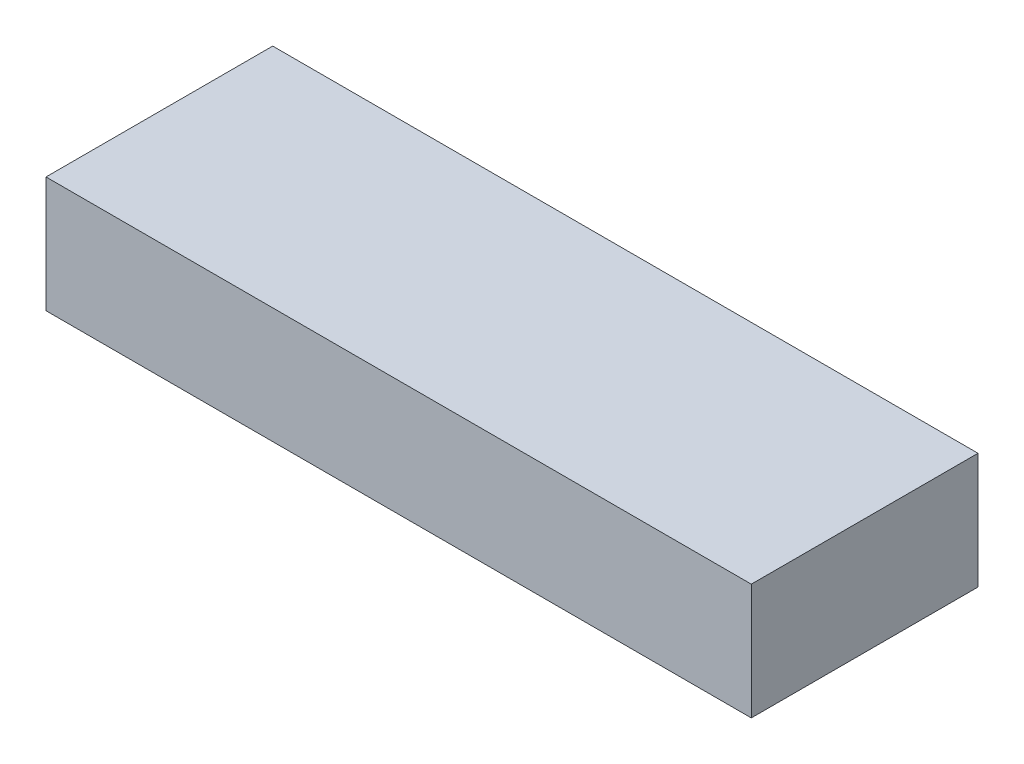
ISO-10303-21;
HEADER;
FILE_DESCRIPTION(('STEP AP214'),'2;1');
FILE_NAME('part.step','',(''),(''),'','','');
FILE_SCHEMA(('AUTOMOTIVE_DESIGN { 1 0 10303 214 1 1 1 1 }'));
ENDSEC;
DATA;
#1=APPLICATION_CONTEXT('core data for automotive mechanical design processes');
#2=APPLICATION_PROTOCOL_DEFINITION('international standard','automotive_design',2000,#1);
#3=PRODUCT_CONTEXT('',#1,'mechanical');
#4=PRODUCT('Part','Part','',(#3));
#5=PRODUCT_RELATED_PRODUCT_CATEGORY('part','',(#4));
#6=PRODUCT_DEFINITION_FORMATION('','',#4);
#7=PRODUCT_DEFINITION_CONTEXT('part definition',#1,'design');
#8=PRODUCT_DEFINITION('design','',#6,#7);
#9=PRODUCT_DEFINITION_SHAPE('','',#8);
#10=(LENGTH_UNIT() NAMED_UNIT(*) SI_UNIT(.MILLI.,.METRE.));
#11=(NAMED_UNIT(*) PLANE_ANGLE_UNIT() SI_UNIT($,.RADIAN.));
#12=(NAMED_UNIT(*) SI_UNIT($,.STERADIAN.) SOLID_ANGLE_UNIT());
#13=UNCERTAINTY_MEASURE_WITH_UNIT(LENGTH_MEASURE(1.E-05),#10,'distance_accuracy_value','');
#14=(GEOMETRIC_REPRESENTATION_CONTEXT(3) GLOBAL_UNCERTAINTY_ASSIGNED_CONTEXT((#13)) GLOBAL_UNIT_ASSIGNED_CONTEXT((#10,
#11,#12)) REPRESENTATION_CONTEXT('',''));
#15=CARTESIAN_POINT('',(0.,0.,0.));
#16=DIRECTION('',(0.,0.,1.));
#17=DIRECTION('',(1.,0.,0.));
#18=AXIS2_PLACEMENT_3D('',#15,#16,#17);
#19=CARTESIAN_POINT('',(70.,23.,22.5));
#20=DIRECTION('',(-1.,0.,0.));
#21=DIRECTION('',(0.,0.,1.));
#22=AXIS2_PLACEMENT_3D('',#19,#20,#21);
#23=PLANE('',#22);
#24=DIRECTION('',(0.,0.,-1.));
#25=VECTOR('',#24,1.);
#26=CARTESIAN_POINT('',(70.,0.,22.5));
#27=LINE('',#26,#25);
#28=CARTESIAN_POINT('',(70.,0.,22.5));
#29=VERTEX_POINT('',#28);
#30=CARTESIAN_POINT('',(70.,0.,-22.5));
#31=VERTEX_POINT('',#30);
#32=EDGE_CURVE('E100',#29,#31,#27,.T.);
#33=ORIENTED_EDGE('',*,*,#32,.T.);
#34=DIRECTION('',(0.,-1.,0.));
#35=VECTOR('',#34,1.);
#36=CARTESIAN_POINT('',(70.,23.,-22.5));
#37=LINE('',#36,#35);
#38=CARTESIAN_POINT('',(70.,23.,-22.5));
#39=VERTEX_POINT('',#38);
#40=EDGE_CURVE('E11',#39,#31,#37,.T.);
#41=ORIENTED_EDGE('',*,*,#40,.F.);
#42=DIRECTION('',(0.,0.,-1.));
#43=VECTOR('',#42,1.);
#44=CARTESIAN_POINT('',(70.,23.,22.5));
#45=LINE('',#44,#43);
#46=CARTESIAN_POINT('',(70.,23.,22.5));
#47=VERTEX_POINT('',#46);
#48=EDGE_CURVE('E88',#47,#39,#45,.T.);
#49=ORIENTED_EDGE('',*,*,#48,.F.);
#50=DIRECTION('',(0.,-1.,0.));
#51=VECTOR('',#50,1.);
#52=CARTESIAN_POINT('',(70.,23.,22.5));
#53=LINE('',#52,#51);
#54=EDGE_CURVE('E96',#47,#29,#53,.T.);
#55=ORIENTED_EDGE('',*,*,#54,.T.);
#56=EDGE_LOOP('',(#33,#41,#49,#55));
#57=FACE_BOUND('',#56,.T.);
#58=ADVANCED_FACE('F37',(#57),#23,.F.);
#59=CARTESIAN_POINT('',(-70.,23.,-22.5));
#60=DIRECTION('',(0.,0.,1.));
#61=DIRECTION('',(1.,0.,0.));
#62=AXIS2_PLACEMENT_3D('',#59,#60,#61);
#63=PLANE('',#62);
#64=DIRECTION('',(-1.,0.,0.));
#65=VECTOR('',#64,1.);
#66=CARTESIAN_POINT('',(-70.,0.,-22.5));
#67=LINE('',#66,#65);
#68=CARTESIAN_POINT('',(-70.,0.,-22.5));
#69=VERTEX_POINT('',#68);
#70=EDGE_CURVE('E92',#31,#69,#67,.T.);
#71=ORIENTED_EDGE('',*,*,#70,.T.);
#72=DIRECTION('',(0.,-1.,0.));
#73=VECTOR('',#72,1.);
#74=CARTESIAN_POINT('',(-70.,23.,-22.5));
#75=LINE('',#74,#73);
#76=CARTESIAN_POINT('',(-70.,23.,-22.5));
#77=VERTEX_POINT('',#76);
#78=EDGE_CURVE('E45',#77,#69,#75,.T.);
#79=ORIENTED_EDGE('',*,*,#78,.F.);
#80=DIRECTION('',(-1.,0.,0.));
#81=VECTOR('',#80,1.);
#82=CARTESIAN_POINT('',(-70.,23.,-22.5));
#83=LINE('',#82,#81);
#84=EDGE_CURVE('E83',#39,#77,#83,.T.);
#85=ORIENTED_EDGE('',*,*,#84,.F.);
#86=ORIENTED_EDGE('',*,*,#40,.T.);
#87=EDGE_LOOP('',(#71,#79,#85,#86));
#88=FACE_BOUND('',#87,.T.);
#89=ADVANCED_FACE('F91',(#88),#63,.F.);
#90=CARTESIAN_POINT('',(-70.,23.,22.5));
#91=DIRECTION('',(1.,0.,0.));
#92=DIRECTION('',(0.,0.,-1.));
#93=AXIS2_PLACEMENT_3D('',#90,#91,#92);
#94=PLANE('',#93);
#95=DIRECTION('',(0.,0.,1.));
#96=VECTOR('',#95,1.);
#97=CARTESIAN_POINT('',(-70.,0.,22.5));
#98=LINE('',#97,#96);
#99=CARTESIAN_POINT('',(-70.,0.,22.5));
#100=VERTEX_POINT('',#99);
#101=EDGE_CURVE('E70',#69,#100,#98,.T.);
#102=ORIENTED_EDGE('',*,*,#101,.T.);
#103=DIRECTION('',(0.,-1.,0.));
#104=VECTOR('',#103,1.);
#105=CARTESIAN_POINT('',(-70.,23.,22.5));
#106=LINE('',#105,#104);
#107=CARTESIAN_POINT('',(-70.,23.,22.5));
#108=VERTEX_POINT('',#107);
#109=EDGE_CURVE('E93',#108,#100,#106,.T.);
#110=ORIENTED_EDGE('',*,*,#109,.F.);
#111=DIRECTION('',(0.,0.,1.));
#112=VECTOR('',#111,1.);
#113=CARTESIAN_POINT('',(-70.,23.,22.5));
#114=LINE('',#113,#112);
#115=EDGE_CURVE('E86',#77,#108,#114,.T.);
#116=ORIENTED_EDGE('',*,*,#115,.F.);
#117=ORIENTED_EDGE('',*,*,#78,.T.);
#118=EDGE_LOOP('',(#102,#110,#116,#117));
#119=FACE_BOUND('',#118,.T.);
#120=ADVANCED_FACE('F94',(#119),#94,.F.);
#121=CARTESIAN_POINT('',(-70.,23.,22.5));
#122=DIRECTION('',(0.,0.,-1.));
#123=DIRECTION('',(-1.,0.,0.));
#124=AXIS2_PLACEMENT_3D('',#121,#122,#123);
#125=PLANE('',#124);
#126=DIRECTION('',(1.,0.,0.));
#127=VECTOR('',#126,1.);
#128=CARTESIAN_POINT('',(-70.,0.,22.5));
#129=LINE('',#128,#127);
#130=EDGE_CURVE('E76',#100,#29,#129,.T.);
#131=ORIENTED_EDGE('',*,*,#130,.T.);
#132=ORIENTED_EDGE('',*,*,#54,.F.);
#133=DIRECTION('',(1.,0.,0.));
#134=VECTOR('',#133,1.);
#135=CARTESIAN_POINT('',(-70.,23.,22.5));
#136=LINE('',#135,#134);
#137=EDGE_CURVE('E53',#108,#47,#136,.T.);
#138=ORIENTED_EDGE('',*,*,#137,.F.);
#139=ORIENTED_EDGE('',*,*,#109,.T.);
#140=EDGE_LOOP('',(#131,#132,#138,#139));
#141=FACE_BOUND('',#140,.T.);
#142=ADVANCED_FACE('F107',(#141),#125,.F.);
#143=CARTESIAN_POINT('',(0.,23.,0.));
#144=DIRECTION('',(0.,-1.,0.));
#145=DIRECTION('',(0.,0.,-1.));
#146=AXIS2_PLACEMENT_3D('',#143,#144,#145);
#147=PLANE('',#146);
#148=ORIENTED_EDGE('',*,*,#48,.T.);
#149=ORIENTED_EDGE('',*,*,#84,.T.);
#150=ORIENTED_EDGE('',*,*,#115,.T.);
#151=ORIENTED_EDGE('',*,*,#137,.T.);
#152=EDGE_LOOP('',(#148,#149,#150,#151));
#153=FACE_BOUND('',#152,.T.);
#154=ADVANCED_FACE('F84',(#153),#147,.F.);
#155=CARTESIAN_POINT('',(0.,0.,0.));
#156=DIRECTION('',(0.,-1.,0.));
#157=DIRECTION('',(0.,0.,-1.));
#158=AXIS2_PLACEMENT_3D('',#155,#156,#157);
#159=PLANE('',#158);
#160=ORIENTED_EDGE('',*,*,#32,.F.);
#161=ORIENTED_EDGE('',*,*,#130,.F.);
#162=ORIENTED_EDGE('',*,*,#101,.F.);
#163=ORIENTED_EDGE('',*,*,#70,.F.);
#164=EDGE_LOOP('',(#160,#161,#162,#163));
#165=FACE_BOUND('',#164,.T.);
#166=ADVANCED_FACE('F110',(#165),#159,.T.);
#167=CLOSED_SHELL('',(#58,#89,#120,#142,#154,#166));
#168=MANIFOLD_SOLID_BREP('B2',#167);
#169=ADVANCED_BREP_SHAPE_REPRESENTATION('',(#18,#168),#14);
#170=SHAPE_DEFINITION_REPRESENTATION(#9,#169);
ENDSEC;
END-ISO-10303-21;
